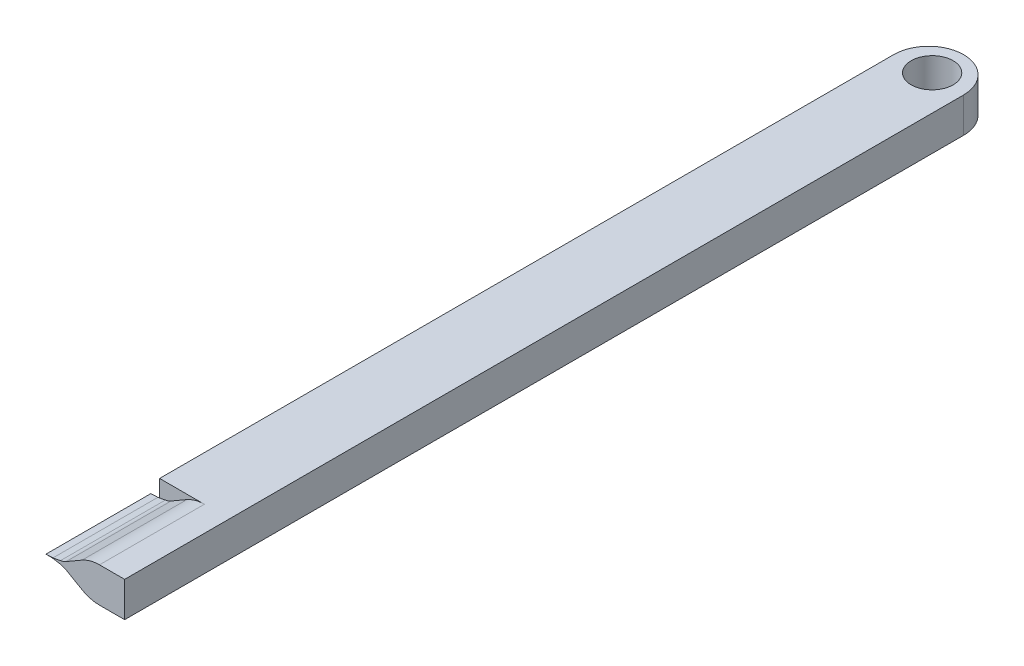
ISO-10303-21;
HEADER;
FILE_DESCRIPTION(('STEP AP214'),'2;1');
FILE_NAME('part.step','',(''),(''),'','','');
FILE_SCHEMA(('AUTOMOTIVE_DESIGN { 1 0 10303 214 1 1 1 1 }'));
ENDSEC;
DATA;
#1=APPLICATION_CONTEXT('core data for automotive mechanical design processes');
#2=APPLICATION_PROTOCOL_DEFINITION('international standard','automotive_design',2000,#1);
#3=PRODUCT_CONTEXT('',#1,'mechanical');
#4=PRODUCT('Part','Part','',(#3));
#5=PRODUCT_RELATED_PRODUCT_CATEGORY('part','',(#4));
#6=PRODUCT_DEFINITION_FORMATION('','',#4);
#7=PRODUCT_DEFINITION_CONTEXT('part definition',#1,'design');
#8=PRODUCT_DEFINITION('design','',#6,#7);
#9=PRODUCT_DEFINITION_SHAPE('','',#8);
#10=(LENGTH_UNIT() NAMED_UNIT(*) SI_UNIT(.MILLI.,.METRE.));
#11=(NAMED_UNIT(*) PLANE_ANGLE_UNIT() SI_UNIT($,.RADIAN.));
#12=(NAMED_UNIT(*) SI_UNIT($,.STERADIAN.) SOLID_ANGLE_UNIT());
#13=UNCERTAINTY_MEASURE_WITH_UNIT(LENGTH_MEASURE(1.E-05),#10,'distance_accuracy_value','');
#14=(GEOMETRIC_REPRESENTATION_CONTEXT(3) GLOBAL_UNCERTAINTY_ASSIGNED_CONTEXT((#13)) GLOBAL_UNIT_ASSIGNED_CONTEXT((#10,
#11,#12)) REPRESENTATION_CONTEXT('',''));
#15=CARTESIAN_POINT('',(0.,0.,0.));
#16=DIRECTION('',(0.,0.,1.));
#17=DIRECTION('',(1.,0.,0.));
#18=AXIS2_PLACEMENT_3D('',#15,#16,#17);
#19=CARTESIAN_POINT('',(0.,0.,250.));
#20=DIRECTION('',(0.,1.,0.));
#21=DIRECTION('',(0.,0.,1.));
#22=AXIS2_PLACEMENT_3D('',#19,#20,#21);
#23=PLANE('',#22);
#24=CARTESIAN_POINT('',(10.,0.,9.));
#25=DIRECTION('',(0.,1.,0.));
#26=DIRECTION('',(0.,0.,1.));
#27=AXIS2_PLACEMENT_3D('',#24,#25,#26);
#28=CIRCLE('',#27,6.);
#29=CARTESIAN_POINT('',(10.,0.,15.));
#30=VERTEX_POINT('',#29);
#31=EDGE_CURVE('E254',#30,#30,#28,.T.);
#32=ORIENTED_EDGE('',*,*,#31,.T.);
#33=EDGE_LOOP('',(#32));
#34=FACE_BOUND('',#33,.T.);
#35=DIRECTION('',(1.,0.,0.));
#36=VECTOR('',#35,1.);
#37=CARTESIAN_POINT('',(0.,0.,250.));
#38=LINE('',#37,#36);
#39=CARTESIAN_POINT('',(12.8025550001605,0.,250.));
#40=VERTEX_POINT('',#39);
#41=CARTESIAN_POINT('',(20.,0.,250.));
#42=VERTEX_POINT('',#41);
#43=EDGE_CURVE('E257',#40,#42,#38,.T.);
#44=ORIENTED_EDGE('',*,*,#43,.F.);
#45=DIRECTION('',(0.,0.,1.));
#46=VECTOR('',#45,1.);
#47=CARTESIAN_POINT('',(12.8025550001605,0.,220.));
#48=LINE('',#47,#46);
#49=CARTESIAN_POINT('',(12.8025550001605,0.,220.));
#50=VERTEX_POINT('',#49);
#51=EDGE_CURVE('E316',#40,#50,#48,.F.);
#52=ORIENTED_EDGE('',*,*,#51,.T.);
#53=DIRECTION('',(1.,0.,0.));
#54=VECTOR('',#53,1.);
#55=CARTESIAN_POINT('',(0.,0.,220.));
#56=LINE('',#55,#54);
#57=CARTESIAN_POINT('',(0.,0.,220.));
#58=VERTEX_POINT('',#57);
#59=EDGE_CURVE('E197',#58,#50,#56,.T.);
#60=ORIENTED_EDGE('',*,*,#59,.F.);
#61=DIRECTION('',(0.,0.,-1.));
#62=VECTOR('',#61,1.);
#63=CARTESIAN_POINT('',(0.,0.,250.));
#64=LINE('',#63,#62);
#65=CARTESIAN_POINT('',(0.,0.,10.));
#66=VERTEX_POINT('',#65);
#67=EDGE_CURVE('E272',#58,#66,#64,.T.);
#68=ORIENTED_EDGE('',*,*,#67,.T.);
#69=CARTESIAN_POINT('',(10.,0.,10.));
#70=DIRECTION('',(0.,1.,0.));
#71=DIRECTION('',(0.,0.,1.));
#72=AXIS2_PLACEMENT_3D('',#69,#70,#71);
#73=CIRCLE('',#72,10.);
#74=CARTESIAN_POINT('',(10.,0.,0.));
#75=VERTEX_POINT('',#74);
#76=EDGE_CURVE('E287',#66,#75,#73,.F.);
#77=ORIENTED_EDGE('',*,*,#76,.T.);
#78=CARTESIAN_POINT('',(10.,0.,10.));
#79=DIRECTION('',(0.,1.,0.));
#80=DIRECTION('',(0.,0.,1.));
#81=AXIS2_PLACEMENT_3D('',#78,#79,#80);
#82=CIRCLE('',#81,10.);
#83=CARTESIAN_POINT('',(20.,0.,10.));
#84=VERTEX_POINT('',#83);
#85=EDGE_CURVE('E282',#75,#84,#82,.F.);
#86=ORIENTED_EDGE('',*,*,#85,.T.);
#87=DIRECTION('',(0.,0.,-1.));
#88=VECTOR('',#87,1.);
#89=CARTESIAN_POINT('',(20.,0.,250.));
#90=LINE('',#89,#88);
#91=EDGE_CURVE('E269',#42,#84,#90,.T.);
#92=ORIENTED_EDGE('',*,*,#91,.F.);
#93=EDGE_LOOP('',(#44,#52,#60,#68,#77,#86,#92));
#94=FACE_BOUND('',#93,.T.);
#95=ADVANCED_FACE('F66',(#34,#94),#23,.F.);
#96=CARTESIAN_POINT('',(0.,0.,250.));
#97=DIRECTION('',(0.,0.,-1.));
#98=DIRECTION('',(-1.,0.,0.));
#99=AXIS2_PLACEMENT_3D('',#96,#97,#98);
#100=PLANE('',#99);
#101=DIRECTION('',(0.866025403784438,-0.500000000000001,0.));
#102=VECTOR('',#101,1.);
#103=CARTESIAN_POINT('',(2.53076576896234,4.38341489389888,250.));
#104=LINE('',#103,#102);
#105=CARTESIAN_POINT('',(3.2635182233307,3.96036006711994,250.));
#106=VERTEX_POINT('',#105);
#107=CARTESIAN_POINT('',(7.80255500016054,1.33974596215562,250.));
#108=VERTEX_POINT('',#107);
#109=EDGE_CURVE('E219',#106,#108,#104,.T.);
#110=ORIENTED_EDGE('',*,*,#109,.T.);
#111=CARTESIAN_POINT('',(12.8025550001605,10.,250.));
#112=DIRECTION('',(0.,0.,-1.));
#113=DIRECTION('',(-1.,0.,0.));
#114=AXIS2_PLACEMENT_3D('',#111,#112,#113);
#115=CIRCLE('',#114,10.);
#116=EDGE_CURVE('E314',#108,#40,#115,.F.);
#117=ORIENTED_EDGE('',*,*,#116,.T.);
#118=ORIENTED_EDGE('',*,*,#43,.T.);
#119=DIRECTION('',(0.,1.,0.));
#120=VECTOR('',#119,1.);
#121=CARTESIAN_POINT('',(20.,0.,250.));
#122=LINE('',#121,#120);
#123=CARTESIAN_POINT('',(20.,10.,250.));
#124=VERTEX_POINT('',#123);
#125=EDGE_CURVE('E259',#42,#124,#122,.T.);
#126=ORIENTED_EDGE('',*,*,#125,.T.);
#127=DIRECTION('',(-1.,0.,0.));
#128=VECTOR('',#127,1.);
#129=CARTESIAN_POINT('',(0.,10.,250.));
#130=LINE('',#129,#128);
#131=CARTESIAN_POINT('',(12.8025550001605,10.,250.));
#132=VERTEX_POINT('',#131);
#133=EDGE_CURVE('E261',#124,#132,#130,.T.);
#134=ORIENTED_EDGE('',*,*,#133,.T.);
#135=CARTESIAN_POINT('',(12.8025550001605,0.,250.));
#136=DIRECTION('',(0.,0.,-1.));
#137=DIRECTION('',(-1.,0.,0.));
#138=AXIS2_PLACEMENT_3D('',#135,#136,#137);
#139=CIRCLE('',#138,10.);
#140=CARTESIAN_POINT('',(7.80255500016053,8.66025403784438,250.));
#141=VERTEX_POINT('',#140);
#142=EDGE_CURVE('E312',#132,#141,#139,.F.);
#143=ORIENTED_EDGE('',*,*,#142,.T.);
#144=DIRECTION('',(0.866025403784438,0.500000000000001,0.));
#145=VECTOR('',#144,1.);
#146=CARTESIAN_POINT('',(-1.79936124995986,3.11658510610112,250.));
#147=LINE('',#146,#145);
#148=CARTESIAN_POINT('',(3.2635182233307,6.03963993288006,250.));
#149=VERTEX_POINT('',#148);
#150=EDGE_CURVE('E241',#149,#141,#147,.T.);
#151=ORIENTED_EDGE('',*,*,#150,.F.);
#152=CARTESIAN_POINT('',(0.763518223330693,10.3697669518022,250.));
#153=DIRECTION('',(0.,0.,-1.));
#154=DIRECTION('',(-1.,0.,0.));
#155=AXIS2_PLACEMENT_3D('',#152,#153,#154);
#156=CIRCLE('',#155,5.);
#157=CARTESIAN_POINT('',(1.63175911166535,5.44572818674121,250.));
#158=VERTEX_POINT('',#157);
#159=EDGE_CURVE('E307',#149,#158,#156,.T.);
#160=ORIENTED_EDGE('',*,*,#159,.T.);
#161=DIRECTION('',(0.984807753012208,0.173648177666931,0.));
#162=VECTOR('',#161,1.);
#163=CARTESIAN_POINT('',(-0.88207080970431,5.0024721466915,250.));
#164=LINE('',#163,#162);
#165=CARTESIAN_POINT('',(-0.5,5.0698415389835,250.));
#166=VERTEX_POINT('',#165);
#167=EDGE_CURVE('E230',#166,#158,#164,.T.);
#168=ORIENTED_EDGE('',*,*,#167,.F.);
#169=DIRECTION('',(0.999390827019096,0.0348994967025013,0.));
#170=VECTOR('',#169,1.);
#171=CARTESIAN_POINT('',(-0.177436121535534,5.08110571782972,250.));
#172=LINE('',#171,#170);
#173=CARTESIAN_POINT('',(-2.5,5.,250.));
#174=VERTEX_POINT('',#173);
#175=EDGE_CURVE('E243',#174,#166,#172,.T.);
#176=ORIENTED_EDGE('',*,*,#175,.F.);
#177=DIRECTION('',(0.999390827019096,-0.0348994967025013,0.));
#178=VECTOR('',#177,1.);
#179=CARTESIAN_POINT('',(0.171346247185095,4.9067145334694,250.));
#180=LINE('',#179,#178);
#181=CARTESIAN_POINT('',(-0.5,4.9301584610165,250.));
#182=VERTEX_POINT('',#181);
#183=EDGE_CURVE('E225',#174,#182,#180,.T.);
#184=ORIENTED_EDGE('',*,*,#183,.T.);
#185=DIRECTION('',(0.984807753012208,-0.173648177666931,0.));
#186=VECTOR('',#185,1.);
#187=CARTESIAN_POINT('',(0.828029906924043,4.69599095723804,250.));
#188=LINE('',#187,#186);
#189=CARTESIAN_POINT('',(1.63175911166535,4.55427181325879,250.));
#190=VERTEX_POINT('',#189);
#191=EDGE_CURVE('E207',#182,#190,#188,.T.);
#192=ORIENTED_EDGE('',*,*,#191,.T.);
#193=CARTESIAN_POINT('',(0.763518223330695,-0.369766951802249,250.));
#194=DIRECTION('',(0.,0.,-1.));
#195=DIRECTION('',(-1.,0.,0.));
#196=AXIS2_PLACEMENT_3D('',#193,#194,#195);
#197=CIRCLE('',#196,5.);
#198=EDGE_CURVE('E305',#190,#106,#197,.T.);
#199=ORIENTED_EDGE('',*,*,#198,.T.);
#200=EDGE_LOOP('',(#110,#117,#118,#126,#134,#143,#151,#160,#168,#176,#184,#192,#199));
#201=FACE_BOUND('',#200,.T.);
#202=ADVANCED_FACE('F337',(#201),#100,.F.);
#203=CARTESIAN_POINT('',(-2.5,0.,220.));
#204=DIRECTION('',(0.,0.,1.));
#205=DIRECTION('',(1.,0.,0.));
#206=AXIS2_PLACEMENT_3D('',#203,#204,#205);
#207=PLANE('',#206);
#208=DIRECTION('',(0.984807753012208,-0.173648177666931,0.));
#209=VECTOR('',#208,1.);
#210=CARTESIAN_POINT('',(0.828029906924043,4.69599095723804,220.));
#211=LINE('',#210,#209);
#212=CARTESIAN_POINT('',(-0.5,4.9301584610165,220.));
#213=VERTEX_POINT('',#212);
#214=CARTESIAN_POINT('',(0.,4.84199497066227,220.));
#215=VERTEX_POINT('',#214);
#216=EDGE_CURVE('E198',#213,#215,#211,.T.);
#217=ORIENTED_EDGE('',*,*,#216,.F.);
#218=DIRECTION('',(0.999390827019096,-0.0348994967025013,0.));
#219=VECTOR('',#218,1.);
#220=CARTESIAN_POINT('',(0.171346247185095,4.9067145334694,220.));
#221=LINE('',#220,#219);
#222=CARTESIAN_POINT('',(-2.5,5.,220.));
#223=VERTEX_POINT('',#222);
#224=EDGE_CURVE('E186',#223,#213,#221,.T.);
#225=ORIENTED_EDGE('',*,*,#224,.F.);
#226=DIRECTION('',(0.999390827019096,0.0348994967025013,0.));
#227=VECTOR('',#226,1.);
#228=CARTESIAN_POINT('',(-0.177436121535534,5.08110571782972,220.));
#229=LINE('',#228,#227);
#230=CARTESIAN_POINT('',(-0.5,5.0698415389835,220.));
#231=VERTEX_POINT('',#230);
#232=EDGE_CURVE('E237',#223,#231,#229,.T.);
#233=ORIENTED_EDGE('',*,*,#232,.T.);
#234=DIRECTION('',(0.984807753012208,0.173648177666931,0.));
#235=VECTOR('',#234,1.);
#236=CARTESIAN_POINT('',(-0.88207080970431,5.0024721466915,220.));
#237=LINE('',#236,#235);
#238=CARTESIAN_POINT('',(0.,5.15800502933773,220.));
#239=VERTEX_POINT('',#238);
#240=EDGE_CURVE('E231',#231,#239,#237,.T.);
#241=ORIENTED_EDGE('',*,*,#240,.T.);
#242=DIRECTION('',(0.,-1.,0.));
#243=VECTOR('',#242,1.);
#244=CARTESIAN_POINT('',(0.,0.,220.));
#245=LINE('',#244,#243);
#246=EDGE_CURVE('E216',#239,#215,#245,.T.);
#247=ORIENTED_EDGE('',*,*,#246,.T.);
#248=EDGE_LOOP('',(#217,#225,#233,#241,#247));
#249=FACE_BOUND('',#248,.T.);
#250=ADVANCED_FACE('F213',(#249),#207,.F.);
#251=CARTESIAN_POINT('',(0.,0.,250.));
#252=DIRECTION('',(1.,0.,0.));
#253=DIRECTION('',(0.,0.,-1.));
#254=AXIS2_PLACEMENT_3D('',#251,#252,#253);
#255=PLANE('',#254);
#256=CARTESIAN_POINT('',(0.,10.,220.));
#257=VERTEX_POINT('',#256);
#258=EDGE_CURVE('E249',#257,#239,#245,.T.);
#259=ORIENTED_EDGE('',*,*,#258,.F.);
#260=DIRECTION('',(0.,0.,-1.));
#261=VECTOR('',#260,1.);
#262=CARTESIAN_POINT('',(0.,10.,250.));
#263=LINE('',#262,#261);
#264=CARTESIAN_POINT('',(0.,10.,10.));
#265=VERTEX_POINT('',#264);
#266=EDGE_CURVE('E264',#257,#265,#263,.T.);
#267=ORIENTED_EDGE('',*,*,#266,.T.);
#268=DIRECTION('',(0.,-1.,0.));
#269=VECTOR('',#268,1.);
#270=CARTESIAN_POINT('',(0.,0.,10.));
#271=LINE('',#270,#269);
#272=EDGE_CURVE('E284',#265,#66,#271,.T.);
#273=ORIENTED_EDGE('',*,*,#272,.T.);
#274=ORIENTED_EDGE('',*,*,#67,.F.);
#275=DIRECTION('',(0.,-1.,0.));
#276=VECTOR('',#275,1.);
#277=CARTESIAN_POINT('',(0.,0.,220.));
#278=LINE('',#277,#276);
#279=EDGE_CURVE('E209',#215,#58,#278,.T.);
#280=ORIENTED_EDGE('',*,*,#279,.F.);
#281=ORIENTED_EDGE('',*,*,#246,.F.);
#282=EDGE_LOOP('',(#259,#267,#273,#274,#280,#281));
#283=FACE_BOUND('',#282,.T.);
#284=ADVANCED_FACE('F376',(#283),#255,.F.);
#285=CARTESIAN_POINT('',(20.,0.,250.));
#286=DIRECTION('',(-1.,0.,0.));
#287=DIRECTION('',(0.,-1.,0.));
#288=AXIS2_PLACEMENT_3D('',#285,#286,#287);
#289=PLANE('',#288);
#290=ORIENTED_EDGE('',*,*,#91,.T.);
#291=DIRECTION('',(0.,1.,0.));
#292=VECTOR('',#291,1.);
#293=CARTESIAN_POINT('',(20.,10.,10.));
#294=LINE('',#293,#292);
#295=CARTESIAN_POINT('',(20.,10.,10.));
#296=VERTEX_POINT('',#295);
#297=EDGE_CURVE('E274',#84,#296,#294,.T.);
#298=ORIENTED_EDGE('',*,*,#297,.T.);
#299=DIRECTION('',(0.,0.,-1.));
#300=VECTOR('',#299,1.);
#301=CARTESIAN_POINT('',(20.,10.,250.));
#302=LINE('',#301,#300);
#303=EDGE_CURVE('E266',#124,#296,#302,.T.);
#304=ORIENTED_EDGE('',*,*,#303,.F.);
#305=ORIENTED_EDGE('',*,*,#125,.F.);
#306=EDGE_LOOP('',(#290,#298,#304,#305));
#307=FACE_BOUND('',#306,.T.);
#308=ADVANCED_FACE('F345',(#307),#289,.F.);
#309=CARTESIAN_POINT('',(0.,10.,250.));
#310=DIRECTION('',(0.,-1.,0.));
#311=DIRECTION('',(0.,0.,-1.));
#312=AXIS2_PLACEMENT_3D('',#309,#310,#311);
#313=PLANE('',#312);
#314=CARTESIAN_POINT('',(10.,10.,9.));
#315=DIRECTION('',(0.,1.,0.));
#316=DIRECTION('',(0.,0.,1.));
#317=AXIS2_PLACEMENT_3D('',#314,#315,#316);
#318=CIRCLE('',#317,6.);
#319=CARTESIAN_POINT('',(10.,10.,15.));
#320=VERTEX_POINT('',#319);
#321=EDGE_CURVE('E251',#320,#320,#318,.T.);
#322=ORIENTED_EDGE('',*,*,#321,.F.);
#323=EDGE_LOOP('',(#322));
#324=FACE_BOUND('',#323,.T.);
#325=DIRECTION('',(-1.,0.,0.));
#326=VECTOR('',#325,1.);
#327=CARTESIAN_POINT('',(0.,10.,220.));
#328=LINE('',#327,#326);
#329=CARTESIAN_POINT('',(12.8025550001605,10.,220.));
#330=VERTEX_POINT('',#329);
#331=EDGE_CURVE('E89',#330,#257,#328,.T.);
#332=ORIENTED_EDGE('',*,*,#331,.F.);
#333=DIRECTION('',(0.,0.,1.));
#334=VECTOR('',#333,1.);
#335=CARTESIAN_POINT('',(12.8025550001605,10.,250.));
#336=LINE('',#335,#334);
#337=EDGE_CURVE('E319',#330,#132,#336,.T.);
#338=ORIENTED_EDGE('',*,*,#337,.T.);
#339=ORIENTED_EDGE('',*,*,#133,.F.);
#340=ORIENTED_EDGE('',*,*,#303,.T.);
#341=CARTESIAN_POINT('',(10.,10.,10.));
#342=DIRECTION('',(0.,-1.,0.));
#343=DIRECTION('',(0.,0.,-1.));
#344=AXIS2_PLACEMENT_3D('',#341,#342,#343);
#345=CIRCLE('',#344,10.);
#346=CARTESIAN_POINT('',(10.,10.,0.));
#347=VERTEX_POINT('',#346);
#348=EDGE_CURVE('E277',#296,#347,#345,.F.);
#349=ORIENTED_EDGE('',*,*,#348,.T.);
#350=CARTESIAN_POINT('',(10.,10.,10.));
#351=DIRECTION('',(0.,-1.,0.));
#352=DIRECTION('',(0.,0.,-1.));
#353=AXIS2_PLACEMENT_3D('',#350,#351,#352);
#354=CIRCLE('',#353,10.);
#355=EDGE_CURVE('E289',#347,#265,#354,.F.);
#356=ORIENTED_EDGE('',*,*,#355,.T.);
#357=ORIENTED_EDGE('',*,*,#266,.F.);
#358=EDGE_LOOP('',(#332,#338,#339,#340,#349,#356,#357));
#359=FACE_BOUND('',#358,.T.);
#360=ADVANCED_FACE('F348',(#324,#359),#313,.F.);
#361=CARTESIAN_POINT('',(10.,-20.,9.));
#362=DIRECTION('',(0.,1.,0.));
#363=DIRECTION('',(0.,0.,1.));
#364=AXIS2_PLACEMENT_3D('',#361,#362,#363);
#365=CYLINDRICAL_SURFACE('',#364,6.);
#366=ORIENTED_EDGE('',*,*,#321,.T.);
#367=EDGE_LOOP('',(#366));
#368=FACE_BOUND('',#367,.T.);
#369=ORIENTED_EDGE('',*,*,#31,.F.);
#370=EDGE_LOOP('',(#369));
#371=FACE_BOUND('',#370,.T.);
#372=ADVANCED_FACE('F385',(#368,#371),#365,.F.);
#373=CARTESIAN_POINT('',(10.,0.,10.));
#374=DIRECTION('',(0.,-1.,0.));
#375=DIRECTION('',(1.,0.,0.));
#376=AXIS2_PLACEMENT_3D('',#373,#374,#375);
#377=CYLINDRICAL_SURFACE('',#376,10.);
#378=ORIENTED_EDGE('',*,*,#85,.F.);
#379=DIRECTION('',(0.,1.,0.));
#380=VECTOR('',#379,1.);
#381=CARTESIAN_POINT('',(10.,0.,0.));
#382=LINE('',#381,#380);
#383=EDGE_CURVE('E279',#347,#75,#382,.F.);
#384=ORIENTED_EDGE('',*,*,#383,.F.);
#385=ORIENTED_EDGE('',*,*,#348,.F.);
#386=ORIENTED_EDGE('',*,*,#297,.F.);
#387=EDGE_LOOP('',(#378,#384,#385,#386));
#388=FACE_BOUND('',#387,.T.);
#389=ADVANCED_FACE('F383',(#388),#377,.T.);
#390=CARTESIAN_POINT('',(10.,0.,10.));
#391=DIRECTION('',(0.,1.,0.));
#392=DIRECTION('',(0.,0.,1.));
#393=AXIS2_PLACEMENT_3D('',#390,#391,#392);
#394=CYLINDRICAL_SURFACE('',#393,10.);
#395=ORIENTED_EDGE('',*,*,#355,.F.);
#396=ORIENTED_EDGE('',*,*,#383,.T.);
#397=ORIENTED_EDGE('',*,*,#76,.F.);
#398=ORIENTED_EDGE('',*,*,#272,.F.);
#399=EDGE_LOOP('',(#395,#396,#397,#398));
#400=FACE_BOUND('',#399,.T.);
#401=ADVANCED_FACE('F380',(#400),#394,.T.);
#402=CARTESIAN_POINT('',(0.,0.,220.));
#403=DIRECTION('',(0.,0.,1.));
#404=DIRECTION('',(1.,0.,0.));
#405=AXIS2_PLACEMENT_3D('',#402,#403,#404);
#406=PLANE('',#405);
#407=CARTESIAN_POINT('',(1.63175911166535,5.44572818674121,220.));
#408=VERTEX_POINT('',#407);
#409=EDGE_CURVE('E234',#239,#408,#237,.T.);
#410=ORIENTED_EDGE('',*,*,#409,.T.);
#411=CARTESIAN_POINT('',(0.763518223330693,10.3697669518022,220.));
#412=DIRECTION('',(0.,0.,1.));
#413=DIRECTION('',(1.,0.,0.));
#414=AXIS2_PLACEMENT_3D('',#411,#412,#413);
#415=CIRCLE('',#414,5.);
#416=CARTESIAN_POINT('',(3.2635182233307,6.03963993288006,220.));
#417=VERTEX_POINT('',#416);
#418=EDGE_CURVE('E303',#408,#417,#415,.T.);
#419=ORIENTED_EDGE('',*,*,#418,.T.);
#420=DIRECTION('',(0.866025403784438,0.500000000000001,0.));
#421=VECTOR('',#420,1.);
#422=CARTESIAN_POINT('',(-1.79936124995986,3.11658510610112,220.));
#423=LINE('',#422,#421);
#424=CARTESIAN_POINT('',(7.80255500016053,8.66025403784438,220.));
#425=VERTEX_POINT('',#424);
#426=EDGE_CURVE('E233',#417,#425,#423,.T.);
#427=ORIENTED_EDGE('',*,*,#426,.T.);
#428=CARTESIAN_POINT('',(12.8025550001605,0.,220.));
#429=DIRECTION('',(0.,0.,1.));
#430=DIRECTION('',(1.,0.,0.));
#431=AXIS2_PLACEMENT_3D('',#428,#429,#430);
#432=CIRCLE('',#431,10.);
#433=EDGE_CURVE('E12',#425,#330,#432,.F.);
#434=ORIENTED_EDGE('',*,*,#433,.T.);
#435=ORIENTED_EDGE('',*,*,#331,.T.);
#436=ORIENTED_EDGE('',*,*,#258,.T.);
#437=EDGE_LOOP('',(#410,#419,#427,#434,#435,#436));
#438=FACE_BOUND('',#437,.T.);
#439=ADVANCED_FACE('F354',(#438),#406,.T.);
#440=CARTESIAN_POINT('',(-0.88207080970431,5.0024721466915,220.));
#441=DIRECTION('',(0.173648177666931,-0.984807753012208,0.));
#442=DIRECTION('',(0.984807753012208,0.173648177666931,0.));
#443=AXIS2_PLACEMENT_3D('',#440,#441,#442);
#444=PLANE('',#443);
#445=ORIENTED_EDGE('',*,*,#167,.T.);
#446=DIRECTION('',(0.,0.,1.));
#447=VECTOR('',#446,1.);
#448=CARTESIAN_POINT('',(1.63175911166535,5.44572818674121,220.));
#449=LINE('',#448,#447);
#450=EDGE_CURVE('E301',#158,#408,#449,.F.);
#451=ORIENTED_EDGE('',*,*,#450,.T.);
#452=ORIENTED_EDGE('',*,*,#409,.F.);
#453=ORIENTED_EDGE('',*,*,#240,.F.);
#454=DIRECTION('',(0.,0.,1.));
#455=VECTOR('',#454,1.);
#456=CARTESIAN_POINT('',(-0.5,5.0698415389835,220.));
#457=LINE('',#456,#455);
#458=EDGE_CURVE('E246',#231,#166,#457,.T.);
#459=ORIENTED_EDGE('',*,*,#458,.T.);
#460=EDGE_LOOP('',(#445,#451,#452,#453,#459));
#461=FACE_BOUND('',#460,.T.);
#462=ADVANCED_FACE('F365',(#461),#444,.F.);
#463=CARTESIAN_POINT('',(-0.177436121535534,5.08110571782972,220.));
#464=DIRECTION('',(0.0348994967025013,-0.999390827019096,0.));
#465=DIRECTION('',(0.999390827019096,0.0348994967025013,0.));
#466=AXIS2_PLACEMENT_3D('',#463,#464,#465);
#467=PLANE('',#466);
#468=ORIENTED_EDGE('',*,*,#175,.T.);
#469=ORIENTED_EDGE('',*,*,#458,.F.);
#470=ORIENTED_EDGE('',*,*,#232,.F.);
#471=DIRECTION('',(0.,0.,1.));
#472=VECTOR('',#471,1.);
#473=CARTESIAN_POINT('',(-2.5,5.,220.));
#474=LINE('',#473,#472);
#475=EDGE_CURVE('E192',#223,#174,#474,.T.);
#476=ORIENTED_EDGE('',*,*,#475,.T.);
#477=EDGE_LOOP('',(#468,#469,#470,#476));
#478=FACE_BOUND('',#477,.T.);
#479=ADVANCED_FACE('F369',(#478),#467,.F.);
#480=CARTESIAN_POINT('',(-1.79936124995986,3.11658510610112,220.));
#481=DIRECTION('',(0.500000000000001,-0.866025403784438,0.));
#482=DIRECTION('',(0.866025403784438,0.500000000000001,0.));
#483=AXIS2_PLACEMENT_3D('',#480,#481,#482);
#484=PLANE('',#483);
#485=ORIENTED_EDGE('',*,*,#150,.T.);
#486=DIRECTION('',(0.,0.,1.));
#487=VECTOR('',#486,1.);
#488=CARTESIAN_POINT('',(7.80255500016053,8.66025403784438,220.));
#489=LINE('',#488,#487);
#490=EDGE_CURVE('E81',#141,#425,#489,.F.);
#491=ORIENTED_EDGE('',*,*,#490,.T.);
#492=ORIENTED_EDGE('',*,*,#426,.F.);
#493=DIRECTION('',(0.,0.,1.));
#494=VECTOR('',#493,1.);
#495=CARTESIAN_POINT('',(3.2635182233307,6.03963993288006,250.));
#496=LINE('',#495,#494);
#497=EDGE_CURVE('E298',#417,#149,#496,.T.);
#498=ORIENTED_EDGE('',*,*,#497,.T.);
#499=EDGE_LOOP('',(#485,#491,#492,#498));
#500=FACE_BOUND('',#499,.T.);
#501=ADVANCED_FACE('F358',(#500),#484,.F.);
#502=CARTESIAN_POINT('',(0.,0.,220.));
#503=DIRECTION('',(0.,0.,1.));
#504=DIRECTION('',(1.,0.,0.));
#505=AXIS2_PLACEMENT_3D('',#502,#503,#504);
#506=PLANE('',#505);
#507=DIRECTION('',(0.866025403784438,-0.500000000000001,0.));
#508=VECTOR('',#507,1.);
#509=CARTESIAN_POINT('',(2.53076576896234,4.38341489389888,220.));
#510=LINE('',#509,#508);
#511=CARTESIAN_POINT('',(3.2635182233307,3.96036006711994,220.));
#512=VERTEX_POINT('',#511);
#513=CARTESIAN_POINT('',(7.80255500016054,1.33974596215562,220.));
#514=VERTEX_POINT('',#513);
#515=EDGE_CURVE('E210',#512,#514,#510,.T.);
#516=ORIENTED_EDGE('',*,*,#515,.F.);
#517=CARTESIAN_POINT('',(0.763518223330695,-0.369766951802249,220.));
#518=DIRECTION('',(0.,0.,1.));
#519=DIRECTION('',(1.,0.,0.));
#520=AXIS2_PLACEMENT_3D('',#517,#518,#519);
#521=CIRCLE('',#520,5.);
#522=CARTESIAN_POINT('',(1.63175911166535,4.55427181325879,220.));
#523=VERTEX_POINT('',#522);
#524=EDGE_CURVE('E296',#512,#523,#521,.T.);
#525=ORIENTED_EDGE('',*,*,#524,.T.);
#526=EDGE_CURVE('E217',#215,#523,#211,.T.);
#527=ORIENTED_EDGE('',*,*,#526,.F.);
#528=ORIENTED_EDGE('',*,*,#279,.T.);
#529=ORIENTED_EDGE('',*,*,#59,.T.);
#530=CARTESIAN_POINT('',(12.8025550001605,10.,220.));
#531=DIRECTION('',(0.,0.,1.));
#532=DIRECTION('',(1.,0.,0.));
#533=AXIS2_PLACEMENT_3D('',#530,#531,#532);
#534=CIRCLE('',#533,10.);
#535=EDGE_CURVE('E74',#50,#514,#534,.F.);
#536=ORIENTED_EDGE('',*,*,#535,.T.);
#537=EDGE_LOOP('',(#516,#525,#527,#528,#529,#536));
#538=FACE_BOUND('',#537,.T.);
#539=ADVANCED_FACE('F324',(#538),#506,.T.);
#540=CARTESIAN_POINT('',(0.828029906924043,4.69599095723804,220.));
#541=DIRECTION('',(-0.173648177666931,-0.984807753012208,0.));
#542=DIRECTION('',(0.984807753012208,-0.173648177666931,0.));
#543=AXIS2_PLACEMENT_3D('',#540,#541,#542);
#544=PLANE('',#543);
#545=ORIENTED_EDGE('',*,*,#526,.T.);
#546=DIRECTION('',(0.,0.,1.));
#547=VECTOR('',#546,1.);
#548=CARTESIAN_POINT('',(1.63175911166535,4.55427181325879,250.));
#549=LINE('',#548,#547);
#550=EDGE_CURVE('E292',#523,#190,#549,.T.);
#551=ORIENTED_EDGE('',*,*,#550,.T.);
#552=ORIENTED_EDGE('',*,*,#191,.F.);
#553=DIRECTION('',(0.,0.,1.));
#554=VECTOR('',#553,1.);
#555=CARTESIAN_POINT('',(-0.5,4.9301584610165,220.));
#556=LINE('',#555,#554);
#557=EDGE_CURVE('E189',#213,#182,#556,.T.);
#558=ORIENTED_EDGE('',*,*,#557,.F.);
#559=ORIENTED_EDGE('',*,*,#216,.T.);
#560=EDGE_LOOP('',(#545,#551,#552,#558,#559));
#561=FACE_BOUND('',#560,.T.);
#562=ADVANCED_FACE('F203',(#561),#544,.T.);
#563=CARTESIAN_POINT('',(2.53076576896234,4.38341489389888,220.));
#564=DIRECTION('',(-0.500000000000001,-0.866025403784438,0.));
#565=DIRECTION('',(0.866025403784438,-0.500000000000001,0.));
#566=AXIS2_PLACEMENT_3D('',#563,#564,#565);
#567=PLANE('',#566);
#568=ORIENTED_EDGE('',*,*,#515,.T.);
#569=DIRECTION('',(0.,0.,1.));
#570=VECTOR('',#569,1.);
#571=CARTESIAN_POINT('',(7.80255500016053,1.33974596215562,250.));
#572=LINE('',#571,#570);
#573=EDGE_CURVE('E309',#514,#108,#572,.T.);
#574=ORIENTED_EDGE('',*,*,#573,.T.);
#575=ORIENTED_EDGE('',*,*,#109,.F.);
#576=DIRECTION('',(0.,0.,1.));
#577=VECTOR('',#576,1.);
#578=CARTESIAN_POINT('',(3.2635182233307,3.96036006711994,220.));
#579=LINE('',#578,#577);
#580=EDGE_CURVE('E294',#106,#512,#579,.F.);
#581=ORIENTED_EDGE('',*,*,#580,.T.);
#582=EDGE_LOOP('',(#568,#574,#575,#581));
#583=FACE_BOUND('',#582,.T.);
#584=ADVANCED_FACE('F331',(#583),#567,.T.);
#585=CARTESIAN_POINT('',(0.171346247185095,4.9067145334694,220.));
#586=DIRECTION('',(-0.0348994967025013,-0.999390827019096,0.));
#587=DIRECTION('',(0.999390827019096,-0.0348994967025013,0.));
#588=AXIS2_PLACEMENT_3D('',#585,#586,#587);
#589=PLANE('',#588);
#590=ORIENTED_EDGE('',*,*,#183,.F.);
#591=ORIENTED_EDGE('',*,*,#475,.F.);
#592=ORIENTED_EDGE('',*,*,#224,.T.);
#593=ORIENTED_EDGE('',*,*,#557,.T.);
#594=EDGE_LOOP('',(#590,#591,#592,#593));
#595=FACE_BOUND('',#594,.T.);
#596=ADVANCED_FACE('F188',(#595),#589,.T.);
#597=CARTESIAN_POINT('',(0.763518223330695,-0.369766951802249,220.));
#598=DIRECTION('',(0.,0.,-1.));
#599=DIRECTION('',(-1.,0.,0.));
#600=AXIS2_PLACEMENT_3D('',#597,#598,#599);
#601=CYLINDRICAL_SURFACE('',#600,5.);
#602=ORIENTED_EDGE('',*,*,#524,.F.);
#603=ORIENTED_EDGE('',*,*,#580,.F.);
#604=ORIENTED_EDGE('',*,*,#198,.F.);
#605=ORIENTED_EDGE('',*,*,#550,.F.);
#606=EDGE_LOOP('',(#602,#603,#604,#605));
#607=FACE_BOUND('',#606,.T.);
#608=ADVANCED_FACE('F372',(#607),#601,.F.);
#609=CARTESIAN_POINT('',(0.763518223330693,10.3697669518022,220.));
#610=DIRECTION('',(0.,0.,-1.));
#611=DIRECTION('',(-1.,0.,0.));
#612=AXIS2_PLACEMENT_3D('',#609,#610,#611);
#613=CYLINDRICAL_SURFACE('',#612,5.);
#614=ORIENTED_EDGE('',*,*,#418,.F.);
#615=ORIENTED_EDGE('',*,*,#450,.F.);
#616=ORIENTED_EDGE('',*,*,#159,.F.);
#617=ORIENTED_EDGE('',*,*,#497,.F.);
#618=EDGE_LOOP('',(#614,#615,#616,#617));
#619=FACE_BOUND('',#618,.T.);
#620=ADVANCED_FACE('F360',(#619),#613,.F.);
#621=CARTESIAN_POINT('',(12.8025550001605,10.,220.));
#622=DIRECTION('',(0.,0.,-1.));
#623=DIRECTION('',(-1.,0.,0.));
#624=AXIS2_PLACEMENT_3D('',#621,#622,#623);
#625=CYLINDRICAL_SURFACE('',#624,10.);
#626=ORIENTED_EDGE('',*,*,#535,.F.);
#627=ORIENTED_EDGE('',*,*,#51,.F.);
#628=ORIENTED_EDGE('',*,*,#116,.F.);
#629=ORIENTED_EDGE('',*,*,#573,.F.);
#630=EDGE_LOOP('',(#626,#627,#628,#629));
#631=FACE_BOUND('',#630,.T.);
#632=ADVANCED_FACE('F334',(#631),#625,.T.);
#633=CARTESIAN_POINT('',(12.8025550001605,0.,250.));
#634=DIRECTION('',(0.,0.,1.));
#635=DIRECTION('',(1.,0.,0.));
#636=AXIS2_PLACEMENT_3D('',#633,#634,#635);
#637=CYLINDRICAL_SURFACE('',#636,10.);
#638=ORIENTED_EDGE('',*,*,#433,.F.);
#639=ORIENTED_EDGE('',*,*,#490,.F.);
#640=ORIENTED_EDGE('',*,*,#142,.F.);
#641=ORIENTED_EDGE('',*,*,#337,.F.);
#642=EDGE_LOOP('',(#638,#639,#640,#641));
#643=FACE_BOUND('',#642,.T.);
#644=ADVANCED_FACE('F68',(#643),#637,.T.);
#645=CLOSED_SHELL('',(#95,#202,#250,#284,#308,#360,#372,#389,#401,#439,#462,#479,#501,#539,#562,
#584,#596,#608,#620,#632,#644));
#646=MANIFOLD_SOLID_BREP('B2',#645);
#647=ADVANCED_BREP_SHAPE_REPRESENTATION('',(#18,#646),#14);
#648=SHAPE_DEFINITION_REPRESENTATION(#9,#647);
ENDSEC;
END-ISO-10303-21;
